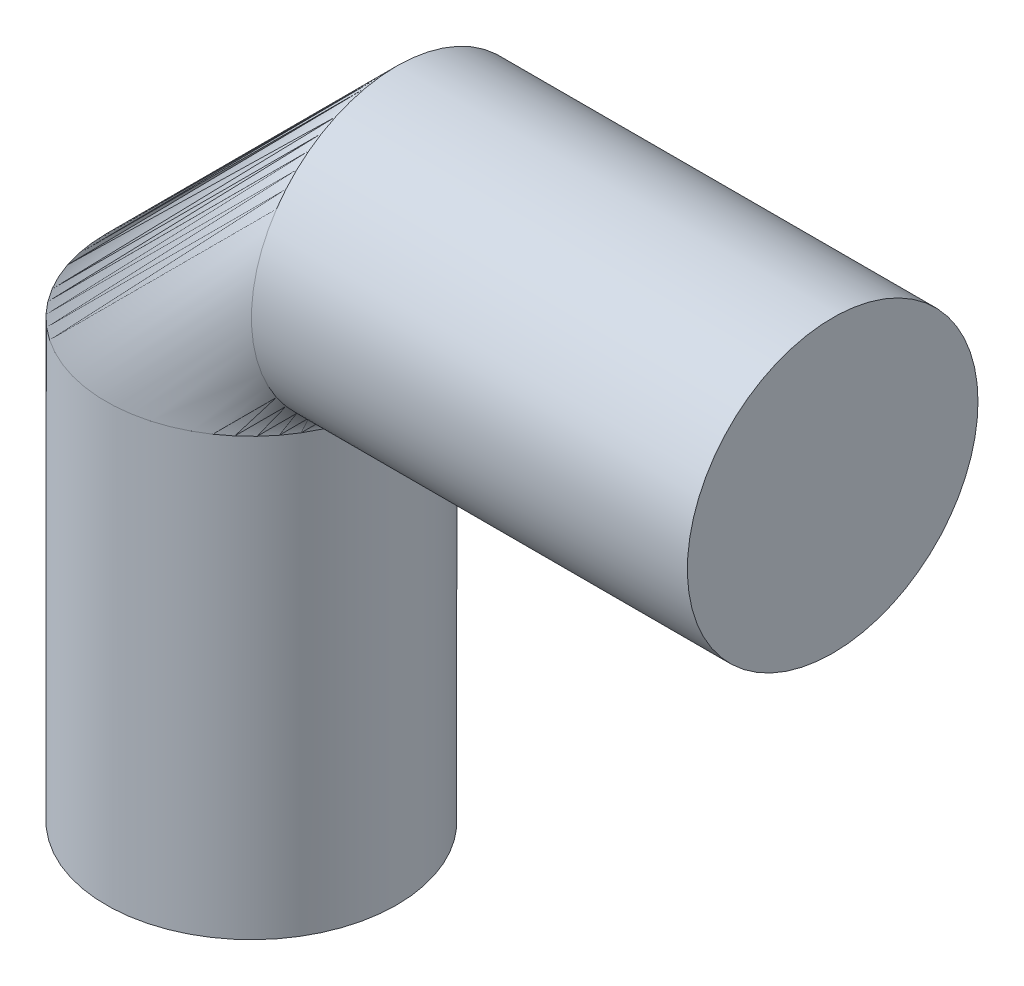
ISO-10303-21;
HEADER;
FILE_DESCRIPTION(('STEP AP214'),'2;1');
FILE_NAME('part.step','',(''),(''),'','','');
FILE_SCHEMA(('AUTOMOTIVE_DESIGN { 1 0 10303 214 1 1 1 1 }'));
ENDSEC;
DATA;
#1=APPLICATION_CONTEXT('core data for automotive mechanical design processes');
#2=APPLICATION_PROTOCOL_DEFINITION('international standard','automotive_design',2000,#1);
#3=PRODUCT_CONTEXT('',#1,'mechanical');
#4=PRODUCT('Part','Part','',(#3));
#5=PRODUCT_RELATED_PRODUCT_CATEGORY('part','',(#4));
#6=PRODUCT_DEFINITION_FORMATION('','',#4);
#7=PRODUCT_DEFINITION_CONTEXT('part definition',#1,'design');
#8=PRODUCT_DEFINITION('design','',#6,#7);
#9=PRODUCT_DEFINITION_SHAPE('','',#8);
#10=(LENGTH_UNIT() NAMED_UNIT(*) SI_UNIT(.MILLI.,.METRE.));
#11=(NAMED_UNIT(*) PLANE_ANGLE_UNIT() SI_UNIT($,.RADIAN.));
#12=(NAMED_UNIT(*) SI_UNIT($,.STERADIAN.) SOLID_ANGLE_UNIT());
#13=UNCERTAINTY_MEASURE_WITH_UNIT(LENGTH_MEASURE(1.E-05),#10,'distance_accuracy_value','');
#14=(GEOMETRIC_REPRESENTATION_CONTEXT(3) GLOBAL_UNCERTAINTY_ASSIGNED_CONTEXT((#13)) GLOBAL_UNIT_ASSIGNED_CONTEXT((#10,
#11,#12)) REPRESENTATION_CONTEXT('',''));
#15=CARTESIAN_POINT('',(0.,0.,0.));
#16=DIRECTION('',(0.,0.,1.));
#17=DIRECTION('',(1.,0.,0.));
#18=AXIS2_PLACEMENT_3D('',#15,#16,#17);
#19=CARTESIAN_POINT('',(12.7,0.,0.));
#20=DIRECTION('',(1.,0.,0.));
#21=DIRECTION('',(0.,0.,-1.));
#22=AXIS2_PLACEMENT_3D('',#19,#20,#21);
#23=PLANE('',#22);
#24=CARTESIAN_POINT('',(12.7,0.,0.));
#25=DIRECTION('',(1.,0.,0.));
#26=DIRECTION('',(0.,0.,-1.));
#27=AXIS2_PLACEMENT_3D('',#24,#25,#26);
#28=CIRCLE('',#27,3.175);
#29=CARTESIAN_POINT('',(12.7,0.,-3.175));
#30=VERTEX_POINT('',#29);
#31=EDGE_CURVE('E50',#30,#30,#28,.T.);
#32=ORIENTED_EDGE('',*,*,#31,.T.);
#33=EDGE_LOOP('',(#32));
#34=FACE_BOUND('',#33,.T.);
#35=ADVANCED_FACE('F35',(#34),#23,.T.);
#36=CARTESIAN_POINT('',(0.,-12.7,0.));
#37=DIRECTION('',(0.,1.,0.));
#38=DIRECTION('',(0.,0.,-1.));
#39=AXIS2_PLACEMENT_3D('',#36,#37,#38);
#40=PLANE('',#39);
#41=CARTESIAN_POINT('',(0.,-12.7,0.));
#42=DIRECTION('',(0.,1.,0.));
#43=DIRECTION('',(0.,0.,-1.));
#44=AXIS2_PLACEMENT_3D('',#41,#42,#43);
#45=CIRCLE('',#44,3.175);
#46=CARTESIAN_POINT('',(0.,-12.7,-3.175));
#47=VERTEX_POINT('',#46);
#48=EDGE_CURVE('E11',#47,#47,#45,.T.);
#49=ORIENTED_EDGE('',*,*,#48,.F.);
#50=EDGE_LOOP('',(#49));
#51=FACE_BOUND('',#50,.T.);
#52=ADVANCED_FACE('F59',(#51),#40,.F.);
#53=CARTESIAN_POINT('',(12.7,0.,0.));
#54=DIRECTION('',(-1.,0.,0.));
#55=DIRECTION('',(0.,0.,1.));
#56=AXIS2_PLACEMENT_3D('',#53,#54,#55);
#57=CYLINDRICAL_SURFACE('',#56,3.175);
#58=CARTESIAN_POINT('',(3.17500000000002,0.,0.));
#59=DIRECTION('',(1.,0.,0.));
#60=DIRECTION('',(0.,0.,-1.));
#61=AXIS2_PLACEMENT_3D('',#58,#59,#60);
#62=CIRCLE('',#61,3.175);
#63=CARTESIAN_POINT('',(3.175,-3.175,0.));
#64=VERTEX_POINT('',#63);
#65=EDGE_CURVE('E46',#64,#64,#62,.T.);
#66=ORIENTED_EDGE('',*,*,#65,.T.);
#67=EDGE_LOOP('',(#66));
#68=FACE_BOUND('',#67,.T.);
#69=ORIENTED_EDGE('',*,*,#31,.F.);
#70=EDGE_LOOP('',(#69));
#71=FACE_BOUND('',#70,.T.);
#72=ADVANCED_FACE('F57',(#68,#71),#57,.T.);
#73=CARTESIAN_POINT('',(3.175,-3.175,0.));
#74=DIRECTION('',(0.,0.,1.));
#75=DIRECTION('',(1.,0.,0.));
#76=AXIS2_PLACEMENT_3D('',#73,#74,#75);
#77=TOROIDAL_SURFACE('',#76,3.17500000000009,3.175);
#78=CARTESIAN_POINT('',(0.,-3.17500000000002,0.));
#79=DIRECTION('',(0.,1.,0.));
#80=DIRECTION('',(0.,0.,-1.));
#81=AXIS2_PLACEMENT_3D('',#78,#79,#80);
#82=CIRCLE('',#81,3.175);
#83=EDGE_CURVE('E41',#64,#64,#82,.T.);
#84=ORIENTED_EDGE('',*,*,#83,.T.);
#85=ORIENTED_EDGE('',*,*,#65,.F.);
#86=EDGE_LOOP('',(#84,#85));
#87=FACE_BOUND('',#86,.T.);
#88=ADVANCED_FACE('F47',(#87),#77,.T.);
#89=CARTESIAN_POINT('',(0.,-3.17500000000002,0.));
#90=DIRECTION('',(0.,-1.,0.));
#91=DIRECTION('',(1.,0.,0.));
#92=AXIS2_PLACEMENT_3D('',#89,#90,#91);
#93=CYLINDRICAL_SURFACE('',#92,3.175);
#94=ORIENTED_EDGE('',*,*,#48,.T.);
#95=EDGE_LOOP('',(#94));
#96=FACE_BOUND('',#95,.T.);
#97=ORIENTED_EDGE('',*,*,#83,.F.);
#98=EDGE_LOOP('',(#97));
#99=FACE_BOUND('',#98,.T.);
#100=ADVANCED_FACE('F65',(#96,#99),#93,.T.);
#101=CLOSED_SHELL('',(#35,#52,#72,#88,#100));
#102=MANIFOLD_SOLID_BREP('B2',#101);
#103=ADVANCED_BREP_SHAPE_REPRESENTATION('',(#18,#102),#14);
#104=SHAPE_DEFINITION_REPRESENTATION(#9,#103);
ENDSEC;
END-ISO-10303-21;
